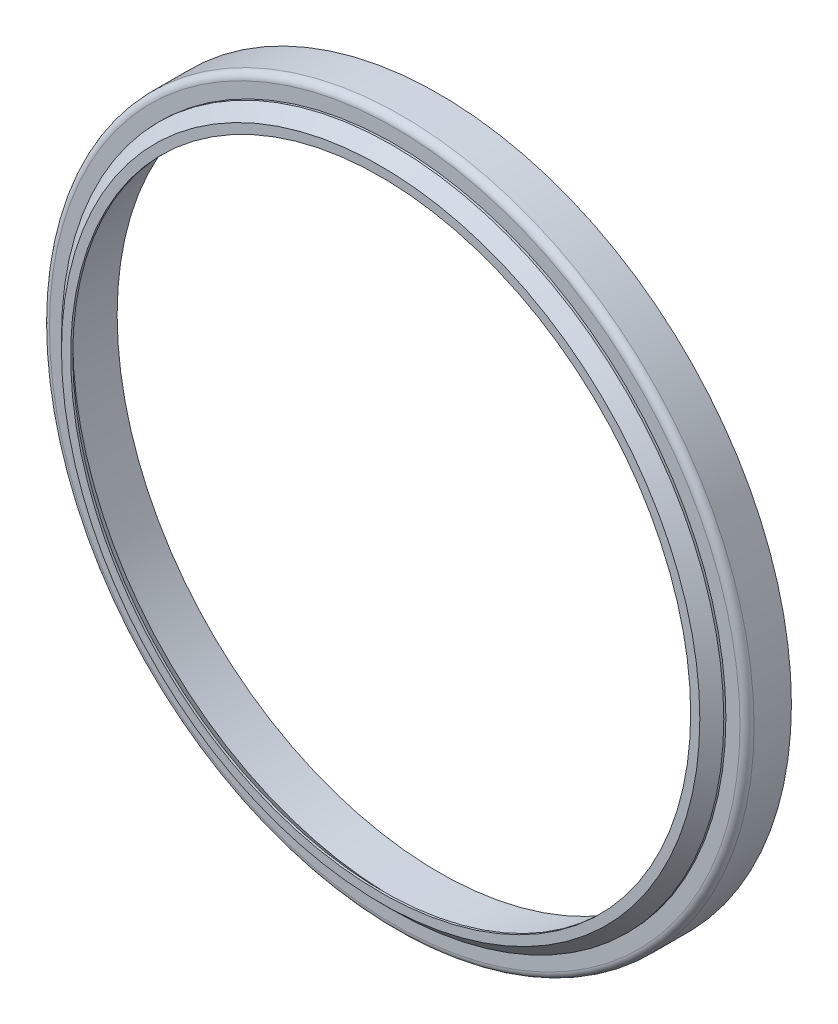
ISO-10303-21;
HEADER;
FILE_DESCRIPTION(('STEP AP214'),'2;1');
FILE_NAME('part.step','',(''),(''),'','','');
FILE_SCHEMA(('AUTOMOTIVE_DESIGN { 1 0 10303 214 1 1 1 1 }'));
ENDSEC;
DATA;
#1=APPLICATION_CONTEXT('core data for automotive mechanical design processes');
#2=APPLICATION_PROTOCOL_DEFINITION('international standard','automotive_design',2000,#1);
#3=PRODUCT_CONTEXT('',#1,'mechanical');
#4=PRODUCT('Part','Part','',(#3));
#5=PRODUCT_RELATED_PRODUCT_CATEGORY('part','',(#4));
#6=PRODUCT_DEFINITION_FORMATION('','',#4);
#7=PRODUCT_DEFINITION_CONTEXT('part definition',#1,'design');
#8=PRODUCT_DEFINITION('design','',#6,#7);
#9=PRODUCT_DEFINITION_SHAPE('','',#8);
#10=(LENGTH_UNIT() NAMED_UNIT(*) SI_UNIT(.MILLI.,.METRE.));
#11=(NAMED_UNIT(*) PLANE_ANGLE_UNIT() SI_UNIT($,.RADIAN.));
#12=(NAMED_UNIT(*) SI_UNIT($,.STERADIAN.) SOLID_ANGLE_UNIT());
#13=UNCERTAINTY_MEASURE_WITH_UNIT(LENGTH_MEASURE(1.E-05),#10,'distance_accuracy_value','');
#14=(GEOMETRIC_REPRESENTATION_CONTEXT(3) GLOBAL_UNCERTAINTY_ASSIGNED_CONTEXT((#13)) GLOBAL_UNIT_ASSIGNED_CONTEXT((#10,
#11,#12)) REPRESENTATION_CONTEXT('',''));
#15=CARTESIAN_POINT('',(0.,0.,0.));
#16=DIRECTION('',(0.,0.,1.));
#17=DIRECTION('',(1.,0.,0.));
#18=AXIS2_PLACEMENT_3D('',#15,#16,#17);
#19=CARTESIAN_POINT('',(0.,0.,6.59999999999997));
#20=DIRECTION('',(0.,0.,-1.));
#21=DIRECTION('',(-1.,0.,0.));
#22=AXIS2_PLACEMENT_3D('',#19,#20,#21);
#23=CONICAL_SURFACE('',#22,47.,0.785398163397445);
#24=CARTESIAN_POINT('',(0.,0.,6.59999999999997));
#25=DIRECTION('',(0.,0.,1.));
#26=DIRECTION('',(1.,0.,0.));
#27=AXIS2_PLACEMENT_3D('',#24,#25,#26);
#28=CIRCLE('',#27,47.);
#29=CARTESIAN_POINT('',(47.,0.,6.59999999999997));
#30=VERTEX_POINT('',#29);
#31=EDGE_CURVE('E56',#30,#30,#28,.F.);
#32=ORIENTED_EDGE('',*,*,#31,.F.);
#33=EDGE_LOOP('',(#32));
#34=FACE_BOUND('',#33,.T.);
#35=CARTESIAN_POINT('',(0.,0.,8.3));
#36=DIRECTION('',(0.,0.,-1.));
#37=DIRECTION('',(-1.,0.,0.));
#38=AXIS2_PLACEMENT_3D('',#35,#36,#37);
#39=CIRCLE('',#38,45.3);
#40=CARTESIAN_POINT('',(-45.3,0.,8.3));
#41=VERTEX_POINT('',#40);
#42=EDGE_CURVE('E96',#41,#41,#39,.F.);
#43=ORIENTED_EDGE('',*,*,#42,.F.);
#44=EDGE_LOOP('',(#43));
#45=FACE_BOUND('',#44,.T.);
#46=ADVANCED_FACE('F18',(#34,#45),#23,.T.);
#47=CARTESIAN_POINT('',(0.,0.,-126.636074863071));
#48=DIRECTION('',(0.,0.,1.));
#49=DIRECTION('',(1.,0.,0.));
#50=AXIS2_PLACEMENT_3D('',#47,#48,#49);
#51=CYLINDRICAL_SURFACE('',#50,47.);
#52=CARTESIAN_POINT('',(0.,0.,6.3));
#53=DIRECTION('',(0.,0.,1.));
#54=DIRECTION('',(1.,0.,0.));
#55=AXIS2_PLACEMENT_3D('',#52,#53,#54);
#56=CIRCLE('',#55,47.);
#57=CARTESIAN_POINT('',(47.,0.,6.3));
#58=VERTEX_POINT('',#57);
#59=EDGE_CURVE('E93',#58,#58,#56,.F.);
#60=ORIENTED_EDGE('',*,*,#59,.F.);
#61=EDGE_LOOP('',(#60));
#62=FACE_BOUND('',#61,.T.);
#63=ORIENTED_EDGE('',*,*,#31,.T.);
#64=EDGE_LOOP('',(#63));
#65=FACE_BOUND('',#64,.T.);
#66=ADVANCED_FACE('F103',(#62,#65),#51,.T.);
#67=CARTESIAN_POINT('',(0.,0.,8.3));
#68=DIRECTION('',(0.,0.,1.));
#69=DIRECTION('',(1.,0.,0.));
#70=AXIS2_PLACEMENT_3D('',#67,#68,#69);
#71=PLANE('',#70);
#72=CARTESIAN_POINT('',(0.,0.,8.3));
#73=DIRECTION('',(0.,0.,1.));
#74=DIRECTION('',(1.,0.,0.));
#75=AXIS2_PLACEMENT_3D('',#72,#73,#74);
#76=CIRCLE('',#75,44.);
#77=CARTESIAN_POINT('',(44.,0.,8.3));
#78=VERTEX_POINT('',#77);
#79=EDGE_CURVE('E42',#78,#78,#76,.F.);
#80=ORIENTED_EDGE('',*,*,#79,.T.);
#81=EDGE_LOOP('',(#80));
#82=FACE_BOUND('',#81,.T.);
#83=ORIENTED_EDGE('',*,*,#42,.T.);
#84=EDGE_LOOP('',(#83));
#85=FACE_BOUND('',#84,.T.);
#86=ADVANCED_FACE('F110',(#82,#85),#71,.T.);
#87=CARTESIAN_POINT('',(0.,0.,6.3));
#88=DIRECTION('',(0.,0.,1.));
#89=DIRECTION('',(1.,0.,0.));
#90=AXIS2_PLACEMENT_3D('',#87,#88,#89);
#91=PLANE('',#90);
#92=ORIENTED_EDGE('',*,*,#59,.T.);
#93=EDGE_LOOP('',(#92));
#94=FACE_BOUND('',#93,.T.);
#95=CARTESIAN_POINT('',(0.,0.,6.3));
#96=DIRECTION('',(0.,0.,-1.));
#97=DIRECTION('',(-1.,0.,0.));
#98=AXIS2_PLACEMENT_3D('',#95,#96,#97);
#99=CIRCLE('',#98,49.);
#100=CARTESIAN_POINT('',(-49.,0.,6.3));
#101=VERTEX_POINT('',#100);
#102=CARTESIAN_POINT('',(49.,0.,6.3));
#103=VERTEX_POINT('',#102);
#104=EDGE_CURVE('E35',#101,#103,#99,.T.);
#105=ORIENTED_EDGE('',*,*,#104,.F.);
#106=CARTESIAN_POINT('',(0.,0.,6.3));
#107=DIRECTION('',(0.,0.,-1.));
#108=DIRECTION('',(1.,0.,0.));
#109=AXIS2_PLACEMENT_3D('',#106,#107,#108);
#110=CIRCLE('',#109,49.);
#111=EDGE_CURVE('E40',#103,#101,#110,.T.);
#112=ORIENTED_EDGE('',*,*,#111,.F.);
#113=EDGE_LOOP('',(#105,#112));
#114=FACE_BOUND('',#113,.T.);
#115=ADVANCED_FACE('F39',(#94,#114),#91,.T.);
#116=CARTESIAN_POINT('',(0.,0.,-126.636074863071));
#117=DIRECTION('',(0.,0.,1.));
#118=DIRECTION('',(1.,0.,0.));
#119=AXIS2_PLACEMENT_3D('',#116,#117,#118);
#120=CYLINDRICAL_SURFACE('',#119,44.);
#121=ORIENTED_EDGE('',*,*,#79,.F.);
#122=EDGE_LOOP('',(#121));
#123=FACE_BOUND('',#122,.T.);
#124=CARTESIAN_POINT('',(0.,0.,8.00000000000004));
#125=DIRECTION('',(0.,0.,-1.));
#126=DIRECTION('',(-1.,0.,0.));
#127=AXIS2_PLACEMENT_3D('',#124,#125,#126);
#128=CIRCLE('',#127,44.);
#129=CARTESIAN_POINT('',(-44.,0.,8.00000000000004));
#130=VERTEX_POINT('',#129);
#131=EDGE_CURVE('E47',#130,#130,#128,.T.);
#132=ORIENTED_EDGE('',*,*,#131,.T.);
#133=EDGE_LOOP('',(#132));
#134=FACE_BOUND('',#133,.T.);
#135=ADVANCED_FACE('F68',(#123,#134),#120,.F.);
#136=CARTESIAN_POINT('',(0.,0.,5.3));
#137=DIRECTION('',(0.,0.,1.));
#138=DIRECTION('',(1.,0.,0.));
#139=AXIS2_PLACEMENT_3D('',#136,#137,#138);
#140=TOROIDAL_SURFACE('',#139,49.,1.);
#141=CARTESIAN_POINT('',(0.,0.,5.3));
#142=DIRECTION('',(0.,0.,-1.));
#143=DIRECTION('',(-1.,0.,0.));
#144=AXIS2_PLACEMENT_3D('',#141,#142,#143);
#145=CIRCLE('',#144,50.);
#146=CARTESIAN_POINT('',(-50.,0.,5.3));
#147=VERTEX_POINT('',#146);
#148=EDGE_CURVE('E74',#147,#147,#145,.T.);
#149=ORIENTED_EDGE('',*,*,#148,.F.);
#150=EDGE_LOOP('',(#149));
#151=FACE_BOUND('',#150,.T.);
#152=ORIENTED_EDGE('',*,*,#111,.T.);
#153=ORIENTED_EDGE('',*,*,#104,.T.);
#154=EDGE_LOOP('',(#152,#153));
#155=FACE_BOUND('',#154,.T.);
#156=ADVANCED_FACE('F46',(#151,#155),#140,.T.);
#157=CARTESIAN_POINT('',(0.,0.,6.30000000000001));
#158=DIRECTION('',(0.,0.,-1.));
#159=DIRECTION('',(-1.,0.,0.));
#160=AXIS2_PLACEMENT_3D('',#157,#158,#159);
#161=CONICAL_SURFACE('',#160,45.7,0.785398163397448);
#162=CARTESIAN_POINT('',(0.,0.,6.3));
#163=DIRECTION('',(0.,0.,-1.));
#164=DIRECTION('',(-1.,0.,0.));
#165=AXIS2_PLACEMENT_3D('',#162,#163,#164);
#166=CIRCLE('',#165,45.7);
#167=CARTESIAN_POINT('',(-45.7,0.,6.3));
#168=VERTEX_POINT('',#167);
#169=EDGE_CURVE('E80',#168,#168,#166,.T.);
#170=ORIENTED_EDGE('',*,*,#169,.T.);
#171=EDGE_LOOP('',(#170));
#172=FACE_BOUND('',#171,.T.);
#173=ORIENTED_EDGE('',*,*,#131,.F.);
#174=EDGE_LOOP('',(#173));
#175=FACE_BOUND('',#174,.T.);
#176=ADVANCED_FACE('F67',(#172,#175),#161,.F.);
#177=CARTESIAN_POINT('',(0.,0.,6.3));
#178=DIRECTION('',(0.,0.,-1.));
#179=DIRECTION('',(-1.,0.,0.));
#180=AXIS2_PLACEMENT_3D('',#177,#178,#179);
#181=CYLINDRICAL_SURFACE('',#180,50.);
#182=ORIENTED_EDGE('',*,*,#148,.T.);
#183=EDGE_LOOP('',(#182));
#184=FACE_BOUND('',#183,.T.);
#185=CARTESIAN_POINT('',(0.,0.,0.));
#186=DIRECTION('',(0.,0.,-1.));
#187=DIRECTION('',(-1.,0.,0.));
#188=AXIS2_PLACEMENT_3D('',#185,#186,#187);
#189=CIRCLE('',#188,50.);
#190=CARTESIAN_POINT('',(-50.,0.,0.));
#191=VERTEX_POINT('',#190);
#192=EDGE_CURVE('E29',#191,#191,#189,.F.);
#193=ORIENTED_EDGE('',*,*,#192,.T.);
#194=EDGE_LOOP('',(#193));
#195=FACE_BOUND('',#194,.T.);
#196=ADVANCED_FACE('F120',(#184,#195),#181,.T.);
#197=CARTESIAN_POINT('',(0.,0.,6.3));
#198=DIRECTION('',(0.,0.,-1.));
#199=DIRECTION('',(-1.,0.,0.));
#200=AXIS2_PLACEMENT_3D('',#197,#198,#199);
#201=CYLINDRICAL_SURFACE('',#200,45.7);
#202=CARTESIAN_POINT('',(0.,0.,0.));
#203=DIRECTION('',(0.,0.,-1.));
#204=DIRECTION('',(-1.,0.,0.));
#205=AXIS2_PLACEMENT_3D('',#202,#203,#204);
#206=CIRCLE('',#205,45.7);
#207=CARTESIAN_POINT('',(-45.7,0.,0.));
#208=VERTEX_POINT('',#207);
#209=EDGE_CURVE('E11',#208,#208,#206,.T.);
#210=ORIENTED_EDGE('',*,*,#209,.T.);
#211=EDGE_LOOP('',(#210));
#212=FACE_BOUND('',#211,.T.);
#213=ORIENTED_EDGE('',*,*,#169,.F.);
#214=EDGE_LOOP('',(#213));
#215=FACE_BOUND('',#214,.T.);
#216=ADVANCED_FACE('F114',(#212,#215),#201,.F.);
#217=CARTESIAN_POINT('',(0.,0.,0.));
#218=DIRECTION('',(0.,0.,1.));
#219=DIRECTION('',(1.,0.,0.));
#220=AXIS2_PLACEMENT_3D('',#217,#218,#219);
#221=PLANE('',#220);
#222=ORIENTED_EDGE('',*,*,#209,.F.);
#223=EDGE_LOOP('',(#222));
#224=FACE_BOUND('',#223,.T.);
#225=ORIENTED_EDGE('',*,*,#192,.F.);
#226=EDGE_LOOP('',(#225));
#227=FACE_BOUND('',#226,.T.);
#228=ADVANCED_FACE('F112',(#224,#227),#221,.F.);
#229=CLOSED_SHELL('',(#46,#66,#86,#115,#135,#156,#176,#196,#216,#228));
#230=MANIFOLD_SOLID_BREP('B1',#229);
#231=ADVANCED_BREP_SHAPE_REPRESENTATION('',(#18,#230),#14);
#232=SHAPE_DEFINITION_REPRESENTATION(#9,#231);
ENDSEC;
END-ISO-10303-21;
